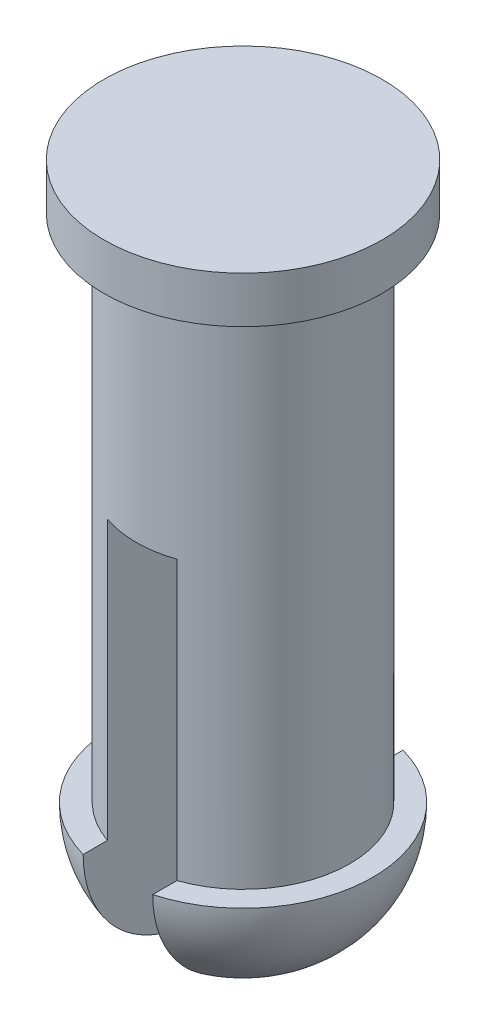
ISO-10303-21;
HEADER;
FILE_DESCRIPTION(('STEP AP214'),'2;1');
FILE_NAME('part.step','',(''),(''),'','','');
FILE_SCHEMA(('AUTOMOTIVE_DESIGN { 1 0 10303 214 1 1 1 1 }'));
ENDSEC;
DATA;
#1=APPLICATION_CONTEXT('core data for automotive mechanical design processes');
#2=APPLICATION_PROTOCOL_DEFINITION('international standard','automotive_design',2000,#1);
#3=PRODUCT_CONTEXT('',#1,'mechanical');
#4=PRODUCT('Part','Part','',(#3));
#5=PRODUCT_RELATED_PRODUCT_CATEGORY('part','',(#4));
#6=PRODUCT_DEFINITION_FORMATION('','',#4);
#7=PRODUCT_DEFINITION_CONTEXT('part definition',#1,'design');
#8=PRODUCT_DEFINITION('design','',#6,#7);
#9=PRODUCT_DEFINITION_SHAPE('','',#8);
#10=(LENGTH_UNIT() NAMED_UNIT(*) SI_UNIT(.MILLI.,.METRE.));
#11=(NAMED_UNIT(*) PLANE_ANGLE_UNIT() SI_UNIT($,.RADIAN.));
#12=(NAMED_UNIT(*) SI_UNIT($,.STERADIAN.) SOLID_ANGLE_UNIT());
#13=UNCERTAINTY_MEASURE_WITH_UNIT(LENGTH_MEASURE(1.E-05),#10,'distance_accuracy_value','');
#14=(GEOMETRIC_REPRESENTATION_CONTEXT(3) GLOBAL_UNCERTAINTY_ASSIGNED_CONTEXT((#13)) GLOBAL_UNIT_ASSIGNED_CONTEXT((#10,
#11,#12)) REPRESENTATION_CONTEXT('',''));
#15=CARTESIAN_POINT('',(0.,0.,0.));
#16=DIRECTION('',(0.,0.,1.));
#17=DIRECTION('',(1.,0.,0.));
#18=AXIS2_PLACEMENT_3D('',#15,#16,#17);
#19=CARTESIAN_POINT('',(0.,0.,0.));
#20=DIRECTION('',(0.,-1.,0.));
#21=DIRECTION('',(1.,0.,0.));
#22=AXIS2_PLACEMENT_3D('',#19,#20,#21);
#23=DEGENERATE_TOROIDAL_SURFACE('',#22,0.0721178571428574,0.639082142857143,.T.);
#24=CARTESIAN_POINT('',(-0.1905,-0.628022016788766,0.));
#25=CARTESIAN_POINT('',(-0.1905,-0.628028978236149,-0.0322642657822718));
#26=CARTESIAN_POINT('',(-0.1905,-0.626532713373925,-0.0645478073916321));
#27=CARTESIAN_POINT('',(-0.1905,-0.619907475511032,-0.128770732883926));
#28=CARTESIAN_POINT('',(-0.1905,-0.614777778845821,-0.160710046920915));
#29=CARTESIAN_POINT('',(-0.1905,-0.60014849956568,-0.223792373025473));
#30=CARTESIAN_POINT('',(-0.1905,-0.59062451547325,-0.254929899822803));
#31=CARTESIAN_POINT('',(-0.1905,-0.567070403691254,-0.315470253688697));
#32=CARTESIAN_POINT('',(-0.1905,-0.553038627973671,-0.344872441664519));
#33=CARTESIAN_POINT('',(-0.1905,-0.518209915824552,-0.405415469906864));
#34=CARTESIAN_POINT('',(-0.1905,-0.496715191844042,-0.436159065767825));
#35=CARTESIAN_POINT('',(-0.1905,-0.448574917127881,-0.493328905184819));
#36=CARTESIAN_POINT('',(-0.1905,-0.421927491568236,-0.519753570809408));
#37=CARTESIAN_POINT('',(-0.1905,-0.365958472762208,-0.566026992115614));
#38=CARTESIAN_POINT('',(-0.1905,-0.336874700482987,-0.586163980368469));
#39=CARTESIAN_POINT('',(-0.1905,-0.27570889998569,-0.621187150844694));
#40=CARTESIAN_POINT('',(-0.1905,-0.243627781161745,-0.636074919177969));
#41=CARTESIAN_POINT('',(-0.1905,-0.177843104470577,-0.659996406166478));
#42=CARTESIAN_POINT('',(-0.1905,-0.144167162083625,-0.669106146876283));
#43=CARTESIAN_POINT('',(-0.1905,-0.0757598623040417,-0.681521015958943));
#44=CARTESIAN_POINT('',(-0.1905,-0.0410284759524324,-0.684825984915537));
#45=CARTESIAN_POINT('',(-0.1905,0.0283707809178741,-0.68553253704169));
#46=CARTESIAN_POINT('',(-0.1905,0.0630384415628409,-0.6829549600045));
#47=CARTESIAN_POINT('',(-0.1905,0.131445867708354,-0.672014897502026));
#48=CARTESIAN_POINT('',(-0.1905,0.165185704546118,-0.663652858084683));
#49=CARTESIAN_POINT('',(-0.1905,0.230775593078655,-0.64138991804363));
#50=CARTESIAN_POINT('',(-0.1905,0.262626118825435,-0.627490413651513));
#51=CARTESIAN_POINT('',(-0.1905,0.323555926140559,-0.594552981969283));
#52=CARTESIAN_POINT('',(-0.1905,0.35263467707002,-0.575514073435235));
#53=CARTESIAN_POINT('',(-0.1905,0.407288537119864,-0.532787861532426));
#54=CARTESIAN_POINT('',(-0.1905,0.432852894729706,-0.509086810371126));
#55=CARTESIAN_POINT('',(-0.1905,0.479670627709356,-0.457777384508035));
#56=CARTESIAN_POINT('',(-0.1905,0.500926039943637,-0.430170866471649));
#57=CARTESIAN_POINT('',(-0.1905,0.538802050050877,-0.371556772988058));
#58=CARTESIAN_POINT('',(-0.1905,0.555374224827971,-0.340517976106002));
#59=CARTESIAN_POINT('',(-0.1905,0.58328873639689,-0.276161459376106));
#60=CARTESIAN_POINT('',(-0.1905,0.594628790597025,-0.242842752147968));
#61=CARTESIAN_POINT('',(-0.1905,0.609282893769181,-0.186037880544955));
#62=CARTESIAN_POINT('',(-0.1905,0.61400888522118,-0.162899592014926));
#63=CARTESIAN_POINT('',(-0.1905,0.62132742517583,-0.116274032273319));
#64=CARTESIAN_POINT('',(-0.1905,0.623918335476879,-0.0927865071401315));
#65=CARTESIAN_POINT('',(-0.1905,0.627287886433082,-0.0456237031929292));
#66=CARTESIAN_POINT('',(-0.1905,0.628061269000977,-0.021948077969727));
#67=CARTESIAN_POINT('',(-0.1905,0.627979825279535,0.0253956019348202));
#68=CARTESIAN_POINT('',(-0.1905,0.627125411357085,0.0490636570147581));
#69=CARTESIAN_POINT('',(-0.1905,0.62384500085713,0.0926697598580589));
#70=CARTESIAN_POINT('',(-0.1905,0.621678430930271,0.112626413228377));
#71=CARTESIAN_POINT('',(-0.1905,0.615825827860026,0.152307670854252));
#72=CARTESIAN_POINT('',(-0.1905,0.612140298519856,0.172032349821309));
#73=CARTESIAN_POINT('',(-0.1905,0.5986191198481,0.230485495946705));
#74=CARTESIAN_POINT('',(-0.1905,0.586307601019496,0.268685743906516));
#75=CARTESIAN_POINT('',(-0.1905,0.554732569913253,0.342479396348517));
#76=CARTESIAN_POINT('',(-0.1905,0.535412235306262,0.378048547339895));
#77=CARTESIAN_POINT('',(-0.1905,0.490291686538236,0.444922383401609));
#78=CARTESIAN_POINT('',(-0.1905,0.464480256586493,0.476219541094841));
#79=CARTESIAN_POINT('',(-0.1905,0.410658356281981,0.529880665855317));
#80=CARTESIAN_POINT('',(-0.1905,0.38325939515636,0.552861562665329));
#81=CARTESIAN_POINT('',(-0.1905,0.324942902050824,0.593758592324518));
#82=CARTESIAN_POINT('',(-0.1905,0.294028806307383,0.611679612778117));
#83=CARTESIAN_POINT('',(-0.1905,0.230273476935128,0.641604134677959));
#84=CARTESIAN_POINT('',(-0.1905,0.197488019113739,0.653726661439146));
#85=CARTESIAN_POINT('',(-0.1905,0.130335119073615,0.672266978907827));
#86=CARTESIAN_POINT('',(-0.1905,0.0959674485512596,0.678683943606885));
#87=CARTESIAN_POINT('',(-0.1905,0.0268197334173961,0.685602981481704));
#88=CARTESIAN_POINT('',(-0.1905,-0.00795731342040789,0.686135059546731));
#89=CARTESIAN_POINT('',(-0.1905,-0.0771048637073369,0.681347216229196));
#90=CARTESIAN_POINT('',(-0.1905,-0.111475385050694,0.676027553401809));
#91=CARTESIAN_POINT('',(-0.1905,-0.178804197514885,0.659698464121075));
#92=CARTESIAN_POINT('',(-0.1905,-0.211763721236249,0.648694118175992));
#93=CARTESIAN_POINT('',(-0.1905,-0.275371554947968,0.621318228724519));
#94=CARTESIAN_POINT('',(-0.1905,-0.306019898705296,0.604946763651908));
#95=CARTESIAN_POINT('',(-0.1905,-0.364202529798429,0.567276200594742));
#96=CARTESIAN_POINT('',(-0.1905,-0.391730871894766,0.545967922910643));
#97=CARTESIAN_POINT('',(-0.1905,-0.44285006665766,0.499060745292707));
#98=CARTESIAN_POINT('',(-0.1905,-0.466440698857277,0.473461605280124));
#99=CARTESIAN_POINT('',(-0.1905,-0.509219017451466,0.418518185170706));
#100=CARTESIAN_POINT('',(-0.1905,-0.5283733182017,0.389147938965258));
#101=CARTESIAN_POINT('',(-0.1905,-0.561612279563981,0.327685407572753));
#102=CARTESIAN_POINT('',(-0.1905,-0.575698286292219,0.295593847956517));
#103=CARTESIAN_POINT('',(-0.1905,-0.598961018152259,0.228690187421494));
#104=CARTESIAN_POINT('',(-0.1905,-0.607989636476232,0.193827135551887));
#105=CARTESIAN_POINT('',(-0.1905,-0.620915926092904,0.123209512982477));
#106=CARTESIAN_POINT('',(-0.1905,-0.624814857729785,0.0874551634716851));
#107=CARTESIAN_POINT('',(-0.1905,-0.627586391477744,0.0344342700410871));
#108=CARTESIAN_POINT('',(-0.1905,-0.628018301368988,0.0172198803831478));
#109=CARTESIAN_POINT('',(-0.1905,-0.628022016788766,0.));
#110=B_SPLINE_CURVE_WITH_KNOTS('',3,(#24,#25,#26,#27,#28,#29,#30,#31,#32,#33,#34,#35,#36,#37,
#38,#39,#40,#41,#42,#43,#44,#45,#46,#47,#48,#49,#50,#51,#52,#53,#54,#55,#56,#57,#58,#59,#60,#61,
#62,#63,#64,#65,#66,#67,#68,#69,#70,#71,#72,#73,#74,#75,#76,#77,#78,#79,#80,#81,#82,#83,#84,#85,
#86,#87,#88,#89,#90,#91,#92,#93,#94,#95,#96,#97,#98,#99,#100,#101,#102,#103,#104,#105,#106,#107,
#108,#109),.UNSPECIFIED.,.T.,.F.,(4,2,2,2,2,2,2,2,2,2,2,2,2,2,2,2,2,2,2,2,2,2,2,2,2,2,2,2,2,2,2,
2,2,2,2,2,2,2,2,2,2,2,4),(0.,0.0967752628432509,0.193569805675638,0.290908440164806,
0.388282701789652,0.500214783767242,0.61218766942305,0.71780133476043,0.823383060356042,
0.927545131447492,1.03171006309384,1.13550654806926,1.23929503004542,1.34305735905521,
1.44683951298135,1.55093241731467,1.65497600097445,1.76005898020212,1.86518776022034,
1.93593607712901,2.00673862728113,2.07774575760701,2.1487349022105,2.20890247092473,
2.26905009950688,2.38877329844792,2.50948964856729,2.63041603185557,2.7371809868521,
2.84384245627393,2.94820899126183,3.05259063319406,3.1564398244008,3.26028442728622,
3.36403638244772,3.46778682147088,3.5717317487274,3.67568249376623,3.78039179447979,
3.88507326430795,3.9926785297043,4.10025735196276,4.15190763470759),.UNSPECIFIED.);
#111=CARTESIAN_POINT('',(-0.1905,0.,0.685211784778984));
#112=VERTEX_POINT('',#111);
#113=CARTESIAN_POINT('',(-0.1905,0.,-0.685211784778984));
#114=VERTEX_POINT('',#113);
#115=EDGE_CURVE('E153',#112,#114,#110,.T.);
#116=ORIENTED_EDGE('',*,*,#115,.F.);
#117=CARTESIAN_POINT('',(0.,0.,0.));
#118=DIRECTION('',(0.,-1.,0.));
#119=DIRECTION('',(1.,0.,0.));
#120=AXIS2_PLACEMENT_3D('',#117,#118,#119);
#121=CIRCLE('',#120,0.7112);
#122=EDGE_CURVE('E155',#112,#114,#121,.T.);
#123=ORIENTED_EDGE('',*,*,#122,.T.);
#124=EDGE_LOOP('',(#116,#123));
#125=FACE_BOUND('',#124,.T.);
#126=ADVANCED_FACE('F36',(#125),#23,.T.);
#127=CARTESIAN_POINT('',(0.5842,0.,0.));
#128=DIRECTION('',(0.,1.,0.));
#129=DIRECTION('',(-1.,0.,0.));
#130=AXIS2_PLACEMENT_3D('',#127,#128,#129);
#131=PLANE('',#130);
#132=DIRECTION('',(0.,0.,1.));
#133=VECTOR('',#132,1.);
#134=CARTESIAN_POINT('',(-0.1905,0.,0.));
#135=LINE('',#134,#133);
#136=CARTESIAN_POINT('',(-0.1905,0.,-0.552267498591036));
#137=VERTEX_POINT('',#136);
#138=EDGE_CURVE('E60',#114,#137,#135,.T.);
#139=ORIENTED_EDGE('',*,*,#138,.F.);
#140=ORIENTED_EDGE('',*,*,#122,.F.);
#141=CARTESIAN_POINT('',(-0.1905,0.,0.552267498591036));
#142=VERTEX_POINT('',#141);
#143=EDGE_CURVE('E161',#142,#112,#135,.T.);
#144=ORIENTED_EDGE('',*,*,#143,.F.);
#145=CARTESIAN_POINT('',(0.,0.,0.));
#146=DIRECTION('',(0.,-1.,0.));
#147=DIRECTION('',(1.,0.,0.));
#148=AXIS2_PLACEMENT_3D('',#145,#146,#147);
#149=CIRCLE('',#148,0.5842);
#150=EDGE_CURVE('E165',#142,#137,#149,.T.);
#151=ORIENTED_EDGE('',*,*,#150,.T.);
#152=EDGE_LOOP('',(#139,#140,#144,#151));
#153=FACE_BOUND('',#152,.T.);
#154=ADVANCED_FACE('F127',(#153),#131,.T.);
#155=CARTESIAN_POINT('',(0.1905,-0.628022016788766,0.));
#156=CARTESIAN_POINT('',(0.1905,-0.628028978236148,0.032264265782271));
#157=CARTESIAN_POINT('',(0.1905,-0.626532713373925,0.0645478073916307));
#158=CARTESIAN_POINT('',(0.1905,-0.619907475511032,0.128770732883923));
#159=CARTESIAN_POINT('',(0.1905,-0.614777778845821,0.160710046920911));
#160=CARTESIAN_POINT('',(0.1905,-0.600148499565681,0.223792373025469));
#161=CARTESIAN_POINT('',(0.1905,-0.590624515473251,0.254929899822797));
#162=CARTESIAN_POINT('',(0.1905,-0.567070403691257,0.31547025368869));
#163=CARTESIAN_POINT('',(0.1905,-0.553038627973674,0.344872441664511));
#164=CARTESIAN_POINT('',(0.1905,-0.518209915824557,0.405415469906856));
#165=CARTESIAN_POINT('',(0.1905,-0.496715191844047,0.436159065767818));
#166=CARTESIAN_POINT('',(0.1905,-0.448574917127887,0.493328905184813));
#167=CARTESIAN_POINT('',(0.1905,-0.421927491568242,0.519753570809402));
#168=CARTESIAN_POINT('',(0.1905,-0.365958472762215,0.566026992115609));
#169=CARTESIAN_POINT('',(0.1905,-0.336874700482994,0.586163980368465));
#170=CARTESIAN_POINT('',(0.1905,-0.275708899985697,0.62118715084469));
#171=CARTESIAN_POINT('',(0.1905,-0.243627781161752,0.636074919177966));
#172=CARTESIAN_POINT('',(0.1905,-0.177843104470585,0.659996406166475));
#173=CARTESIAN_POINT('',(0.1905,-0.144167162083633,0.669106146876281));
#174=CARTESIAN_POINT('',(0.1905,-0.0757598623040498,0.681521015958942));
#175=CARTESIAN_POINT('',(0.1905,-0.0410284759524405,0.684825984915537));
#176=CARTESIAN_POINT('',(0.1905,0.0283707809178661,0.68553253704169));
#177=CARTESIAN_POINT('',(0.1905,0.0630384415628329,0.682954960004501));
#178=CARTESIAN_POINT('',(0.1905,0.131445867708346,0.672014897502028));
#179=CARTESIAN_POINT('',(0.1905,0.16518570454611,0.663652858084685));
#180=CARTESIAN_POINT('',(0.1905,0.230775593078648,0.641389918043633));
#181=CARTESIAN_POINT('',(0.1905,0.262626118825427,0.627490413651517));
#182=CARTESIAN_POINT('',(0.1905,0.323555926140552,0.594552981969288));
#183=CARTESIAN_POINT('',(0.1905,0.352634677070014,0.575514073435239));
#184=CARTESIAN_POINT('',(0.1905,0.407288537119858,0.532787861532431));
#185=CARTESIAN_POINT('',(0.1905,0.4328528947297,0.509086810371132));
#186=CARTESIAN_POINT('',(0.1905,0.479670627709351,0.457777384508042));
#187=CARTESIAN_POINT('',(0.1905,0.500926039943633,0.430170866471656));
#188=CARTESIAN_POINT('',(0.1905,0.538802050050873,0.371556772988065));
#189=CARTESIAN_POINT('',(0.1905,0.555374224827967,0.340517976106009));
#190=CARTESIAN_POINT('',(0.1905,0.583288736396887,0.276161459376114));
#191=CARTESIAN_POINT('',(0.1905,0.594628790597023,0.242842752147977));
#192=CARTESIAN_POINT('',(0.1905,0.609282893769179,0.186037880544964));
#193=CARTESIAN_POINT('',(0.1905,0.614008885221178,0.162899592014935));
#194=CARTESIAN_POINT('',(0.1905,0.621327425175829,0.116274032273329));
#195=CARTESIAN_POINT('',(0.1905,0.623918335476878,0.0927865071401422));
#196=CARTESIAN_POINT('',(0.1905,0.627287886433082,0.0456237031929409));
#197=CARTESIAN_POINT('',(0.1905,0.628061269000977,0.0219480779697393));
#198=CARTESIAN_POINT('',(0.1905,0.627979825279536,-0.0253956019348071));
#199=CARTESIAN_POINT('',(0.1905,0.627125411357086,-0.0490636570147447));
#200=CARTESIAN_POINT('',(0.1905,0.623845000857132,-0.0926697598580456));
#201=CARTESIAN_POINT('',(0.1905,0.621678430930273,-0.112626413228364));
#202=CARTESIAN_POINT('',(0.1905,0.615825827860028,-0.15230767085424));
#203=CARTESIAN_POINT('',(0.1905,0.612140298519859,-0.172032349821297));
#204=CARTESIAN_POINT('',(0.1905,0.598619119848104,-0.230485495946695));
#205=CARTESIAN_POINT('',(0.1905,0.586307601019499,-0.268685743906506));
#206=CARTESIAN_POINT('',(0.1905,0.554732569913257,-0.342479396348509));
#207=CARTESIAN_POINT('',(0.1905,0.535412235306266,-0.378048547339888));
#208=CARTESIAN_POINT('',(0.1905,0.49029168653824,-0.444922383401603));
#209=CARTESIAN_POINT('',(0.1905,0.464480256586497,-0.476219541094837));
#210=CARTESIAN_POINT('',(0.1905,0.410658356281985,-0.529880665855314));
#211=CARTESIAN_POINT('',(0.1905,0.383259395156364,-0.552861562665326));
#212=CARTESIAN_POINT('',(0.1905,0.324942902050828,-0.593758592324515));
#213=CARTESIAN_POINT('',(0.1905,0.294028806307387,-0.611679612778115));
#214=CARTESIAN_POINT('',(0.1905,0.230273476935132,-0.641604134677957));
#215=CARTESIAN_POINT('',(0.1905,0.197488019113743,-0.653726661439144));
#216=CARTESIAN_POINT('',(0.1905,0.130335119073619,-0.672266978907826));
#217=CARTESIAN_POINT('',(0.1905,0.0959674485512638,-0.678683943606884));
#218=CARTESIAN_POINT('',(0.1905,0.0268197334174004,-0.685602981481703));
#219=CARTESIAN_POINT('',(0.1905,-0.00795731342040355,-0.686135059546732));
#220=CARTESIAN_POINT('',(0.1905,-0.0771048637073325,-0.681347216229197));
#221=CARTESIAN_POINT('',(0.1905,-0.11147538505069,-0.67602755340181));
#222=CARTESIAN_POINT('',(0.1905,-0.17880419751488,-0.659698464121077));
#223=CARTESIAN_POINT('',(0.1905,-0.211763721236245,-0.648694118175993));
#224=CARTESIAN_POINT('',(0.1905,-0.275371554947964,-0.621318228724521));
#225=CARTESIAN_POINT('',(0.1905,-0.306019898705292,-0.604946763651911));
#226=CARTESIAN_POINT('',(0.1905,-0.364202529798425,-0.567276200594744));
#227=CARTESIAN_POINT('',(0.1905,-0.391730871894762,-0.545967922910646));
#228=CARTESIAN_POINT('',(0.1905,-0.442850066657657,-0.49906074529271));
#229=CARTESIAN_POINT('',(0.1905,-0.466440698857274,-0.473461605280127));
#230=CARTESIAN_POINT('',(0.1905,-0.509219017451464,-0.41851818517071));
#231=CARTESIAN_POINT('',(0.1905,-0.528373318201698,-0.389147938965261));
#232=CARTESIAN_POINT('',(0.1905,-0.561612279563979,-0.327685407572756));
#233=CARTESIAN_POINT('',(0.1905,-0.575698286292217,-0.295593847956521));
#234=CARTESIAN_POINT('',(0.1905,-0.598961018152258,-0.228690187421498));
#235=CARTESIAN_POINT('',(0.1905,-0.60798963647623,-0.193827135551892));
#236=CARTESIAN_POINT('',(0.1905,-0.620915926092903,-0.123209512982483));
#237=CARTESIAN_POINT('',(0.1905,-0.624814857729784,-0.0874551634716901));
#238=CARTESIAN_POINT('',(0.1905,-0.627586391477743,-0.0344342700410905));
#239=CARTESIAN_POINT('',(0.1905,-0.628018301368987,-0.0172198803831495));
#240=CARTESIAN_POINT('',(0.1905,-0.628022016788766,0.));
#241=B_SPLINE_CURVE_WITH_KNOTS('',3,(#155,#156,#157,#158,#159,#160,#161,#162,#163,#164,#165,
#166,#167,#168,#169,#170,#171,#172,#173,#174,#175,#176,#177,#178,#179,#180,#181,#182,#183,#184,
#185,#186,#187,#188,#189,#190,#191,#192,#193,#194,#195,#196,#197,#198,#199,#200,#201,#202,#203,
#204,#205,#206,#207,#208,#209,#210,#211,#212,#213,#214,#215,#216,#217,#218,#219,#220,#221,#222,
#223,#224,#225,#226,#227,#228,#229,#230,#231,#232,#233,#234,#235,#236,#237,#238,#239,#240),
.UNSPECIFIED.,.T.,.F.,(4,2,2,2,2,2,2,2,2,2,2,2,2,2,2,2,2,2,2,2,2,2,2,2,2,2,2,2,2,2,2,2,2,2,2,2,
2,2,2,2,2,2,4),(0.,0.0967752628432487,0.193569805675633,0.2909084401648,0.388282701789643,
0.500214783767234,0.612187669423042,0.717801334760421,0.823383060356033,0.927545131447484,
1.03171006309383,1.13550654806925,1.23929503004541,1.34305735905521,1.44683951298134,
1.55093241731466,1.65497600097444,1.76005898020211,1.86518776022033,1.935936077129,
2.00673862728112,2.077745757607,2.14873490221049,2.20890247092471,2.26905009950687,
2.38877329844791,2.50948964856728,2.63041603185557,2.7371809868521,2.84384245627392,
2.94820899126183,3.05259063319406,3.1564398244008,3.26028442728622,3.36403638244771,
3.46778682147087,3.5717317487274,3.67568249376622,3.78039179447978,3.88507326430794,
3.99267852970429,4.10025735196276,4.15190763470759),.UNSPECIFIED.);
#242=CARTESIAN_POINT('',(0.1905,0.,-0.685211784778984));
#243=VERTEX_POINT('',#242);
#244=CARTESIAN_POINT('',(0.1905,0.,0.685211784778984));
#245=VERTEX_POINT('',#244);
#246=EDGE_CURVE('E107',#243,#245,#241,.T.);
#247=ORIENTED_EDGE('',*,*,#246,.F.);
#248=EDGE_CURVE('E163',#243,#245,#121,.T.);
#249=ORIENTED_EDGE('',*,*,#248,.T.);
#250=EDGE_LOOP('',(#247,#249));
#251=FACE_BOUND('',#250,.T.);
#252=ADVANCED_FACE('F38',(#251),#23,.T.);
#253=CARTESIAN_POINT('',(0.,3.048,0.));
#254=DIRECTION('',(0.,1.,0.));
#255=DIRECTION('',(-1.,0.,0.));
#256=AXIS2_PLACEMENT_3D('',#253,#254,#255);
#257=PLANE('',#256);
#258=CARTESIAN_POINT('',(0.,3.04799999999994,0.));
#259=DIRECTION('',(0.,-1.,0.));
#260=DIRECTION('',(1.,0.,0.));
#261=AXIS2_PLACEMENT_3D('',#258,#259,#260);
#262=CIRCLE('',#261,0.76200000000001);
#263=CARTESIAN_POINT('',(0.762,3.04799999999994,0.));
#264=VERTEX_POINT('',#263);
#265=EDGE_CURVE('E176',#264,#264,#262,.T.);
#266=ORIENTED_EDGE('',*,*,#265,.F.);
#267=EDGE_LOOP('',(#266));
#268=FACE_BOUND('',#267,.T.);
#269=ADVANCED_FACE('F136',(#268),#257,.T.);
#270=CARTESIAN_POINT('',(3.43024899888577E-12,-1000.,0.));
#271=DIRECTION('',(0.,-1.,0.));
#272=DIRECTION('',(1.,0.,0.));
#273=AXIS2_PLACEMENT_3D('',#270,#271,#272);
#274=CYLINDRICAL_SURFACE('',#273,0.76200000000001);
#275=ORIENTED_EDGE('',*,*,#265,.T.);
#276=EDGE_LOOP('',(#275));
#277=FACE_BOUND('',#276,.T.);
#278=CARTESIAN_POINT('',(0.,2.79399999999996,0.));
#279=DIRECTION('',(0.,-1.,0.));
#280=DIRECTION('',(1.,0.,0.));
#281=AXIS2_PLACEMENT_3D('',#278,#279,#280);
#282=CIRCLE('',#281,0.76200000000001);
#283=CARTESIAN_POINT('',(0.762,2.79399999999997,0.));
#284=VERTEX_POINT('',#283);
#285=EDGE_CURVE('E173',#284,#284,#282,.T.);
#286=ORIENTED_EDGE('',*,*,#285,.F.);
#287=EDGE_LOOP('',(#286));
#288=FACE_BOUND('',#287,.T.);
#289=ADVANCED_FACE('F133',(#277,#288),#274,.T.);
#290=CARTESIAN_POINT('',(0.762,2.794,0.));
#291=DIRECTION('',(0.,-1.,0.));
#292=DIRECTION('',(1.,0.,0.));
#293=AXIS2_PLACEMENT_3D('',#290,#291,#292);
#294=PLANE('',#293);
#295=ORIENTED_EDGE('',*,*,#285,.T.);
#296=EDGE_LOOP('',(#295));
#297=FACE_BOUND('',#296,.T.);
#298=CARTESIAN_POINT('',(0.,2.79399999999996,0.));
#299=DIRECTION('',(0.,-1.,0.));
#300=DIRECTION('',(1.,0.,0.));
#301=AXIS2_PLACEMENT_3D('',#298,#299,#300);
#302=CIRCLE('',#301,0.58420000000001);
#303=CARTESIAN_POINT('',(0.5842,2.79399999999997,0.));
#304=VERTEX_POINT('',#303);
#305=EDGE_CURVE('E170',#304,#304,#302,.T.);
#306=ORIENTED_EDGE('',*,*,#305,.F.);
#307=EDGE_LOOP('',(#306));
#308=FACE_BOUND('',#307,.T.);
#309=ADVANCED_FACE('F130',(#297,#308),#294,.T.);
#310=CARTESIAN_POINT('',(3.43024899888577E-12,-1000.,0.));
#311=DIRECTION('',(0.,-1.,0.));
#312=DIRECTION('',(1.,0.,0.));
#313=AXIS2_PLACEMENT_3D('',#310,#311,#312);
#314=CYLINDRICAL_SURFACE('',#313,0.584200000000005);
#315=DIRECTION('',(0.,-1.,0.));
#316=VECTOR('',#315,1.);
#317=CARTESIAN_POINT('',(-0.1905,-1000.,0.552267498589858));
#318=LINE('',#317,#316);
#319=CARTESIAN_POINT('',(-0.1905,1.52400000000008,0.552267498591043));
#320=VERTEX_POINT('',#319);
#321=EDGE_CURVE('E157',#320,#142,#318,.T.);
#322=ORIENTED_EDGE('',*,*,#321,.F.);
#323=CARTESIAN_POINT('',(0.,1.52400000000008,0.));
#324=DIRECTION('',(0.,1.,0.));
#325=DIRECTION('',(0.,0.,1.));
#326=AXIS2_PLACEMENT_3D('',#323,#324,#325);
#327=CIRCLE('',#326,0.584200000000005);
#328=CARTESIAN_POINT('',(0.1905,1.524,0.552267498592139));
#329=VERTEX_POINT('',#328);
#330=EDGE_CURVE('E11',#329,#320,#327,.F.);
#331=ORIENTED_EDGE('',*,*,#330,.F.);
#332=DIRECTION('',(0.,-1.,0.));
#333=VECTOR('',#332,1.);
#334=CARTESIAN_POINT('',(0.190500000000248,-1000.,0.552267498592139));
#335=LINE('',#334,#333);
#336=CARTESIAN_POINT('',(0.1905,0.,0.552267498591036));
#337=VERTEX_POINT('',#336);
#338=EDGE_CURVE('E99',#337,#329,#335,.F.);
#339=ORIENTED_EDGE('',*,*,#338,.F.);
#340=CARTESIAN_POINT('',(0.1905,0.,-0.552267498591036));
#341=VERTEX_POINT('',#340);
#342=EDGE_CURVE('E106',#341,#337,#149,.T.);
#343=ORIENTED_EDGE('',*,*,#342,.F.);
#344=DIRECTION('',(0.,-1.,0.));
#345=VECTOR('',#344,1.);
#346=CARTESIAN_POINT('',(0.190500000000248,-1000.,-0.552267498592139));
#347=LINE('',#346,#345);
#348=CARTESIAN_POINT('',(0.1905,1.524,-0.552267498592139));
#349=VERTEX_POINT('',#348);
#350=EDGE_CURVE('E52',#349,#341,#347,.T.);
#351=ORIENTED_EDGE('',*,*,#350,.F.);
#352=CARTESIAN_POINT('',(-0.1905,1.52400000000008,-0.552267498591043));
#353=VERTEX_POINT('',#352);
#354=EDGE_CURVE('E41',#353,#349,#327,.F.);
#355=ORIENTED_EDGE('',*,*,#354,.F.);
#356=DIRECTION('',(0.,-1.,0.));
#357=VECTOR('',#356,1.);
#358=CARTESIAN_POINT('',(-0.1905,-1000.,-0.552267498589858));
#359=LINE('',#358,#357);
#360=EDGE_CURVE('E156',#137,#353,#359,.F.);
#361=ORIENTED_EDGE('',*,*,#360,.F.);
#362=ORIENTED_EDGE('',*,*,#150,.F.);
#363=EDGE_LOOP('',(#322,#331,#339,#343,#351,#355,#361,#362));
#364=FACE_BOUND('',#363,.T.);
#365=ORIENTED_EDGE('',*,*,#305,.T.);
#366=EDGE_LOOP('',(#365));
#367=FACE_BOUND('',#366,.T.);
#368=ADVANCED_FACE('F103',(#364,#367),#314,.T.);
#369=DIRECTION('',(0.,0.,-1.));
#370=VECTOR('',#369,1.);
#371=CARTESIAN_POINT('',(0.1905,0.,0.));
#372=LINE('',#371,#370);
#373=EDGE_CURVE('E180',#245,#337,#372,.T.);
#374=ORIENTED_EDGE('',*,*,#373,.F.);
#375=ORIENTED_EDGE('',*,*,#248,.F.);
#376=EDGE_CURVE('E179',#341,#243,#372,.T.);
#377=ORIENTED_EDGE('',*,*,#376,.F.);
#378=ORIENTED_EDGE('',*,*,#342,.T.);
#379=EDGE_LOOP('',(#374,#375,#377,#378));
#380=FACE_BOUND('',#379,.T.);
#381=ADVANCED_FACE('F122',(#380),#131,.T.);
#382=CARTESIAN_POINT('',(-0.1905,0.,-1.27));
#383=DIRECTION('',(-1.,0.,0.));
#384=DIRECTION('',(0.,0.,1.));
#385=AXIS2_PLACEMENT_3D('',#382,#383,#384);
#386=PLANE('',#385);
#387=ORIENTED_EDGE('',*,*,#360,.T.);
#388=DIRECTION('',(0.,0.,1.));
#389=VECTOR('',#388,1.);
#390=CARTESIAN_POINT('',(-0.1905,1.524,-1.27));
#391=LINE('',#390,#389);
#392=EDGE_CURVE('E95',#353,#320,#391,.T.);
#393=ORIENTED_EDGE('',*,*,#392,.T.);
#394=ORIENTED_EDGE('',*,*,#321,.T.);
#395=ORIENTED_EDGE('',*,*,#143,.T.);
#396=ORIENTED_EDGE('',*,*,#115,.T.);
#397=ORIENTED_EDGE('',*,*,#138,.T.);
#398=EDGE_LOOP('',(#387,#393,#394,#395,#396,#397));
#399=FACE_BOUND('',#398,.T.);
#400=ADVANCED_FACE('F125',(#399),#386,.F.);
#401=CARTESIAN_POINT('',(-0.1905,1.524,-1.27));
#402=DIRECTION('',(0.,1.,0.));
#403=DIRECTION('',(0.,0.,1.));
#404=AXIS2_PLACEMENT_3D('',#401,#402,#403);
#405=PLANE('',#404);
#406=ORIENTED_EDGE('',*,*,#354,.T.);
#407=DIRECTION('',(0.,0.,1.));
#408=VECTOR('',#407,1.);
#409=CARTESIAN_POINT('',(0.1905,1.524,-1.27));
#410=LINE('',#409,#408);
#411=EDGE_CURVE('E92',#349,#329,#410,.T.);
#412=ORIENTED_EDGE('',*,*,#411,.T.);
#413=ORIENTED_EDGE('',*,*,#330,.T.);
#414=ORIENTED_EDGE('',*,*,#392,.F.);
#415=EDGE_LOOP('',(#406,#412,#413,#414));
#416=FACE_BOUND('',#415,.T.);
#417=ADVANCED_FACE('F91',(#416),#405,.F.);
#418=CARTESIAN_POINT('',(0.1905,1.524,-1.27));
#419=DIRECTION('',(1.,0.,0.));
#420=DIRECTION('',(0.,1.,0.));
#421=AXIS2_PLACEMENT_3D('',#418,#419,#420);
#422=PLANE('',#421);
#423=ORIENTED_EDGE('',*,*,#338,.T.);
#424=ORIENTED_EDGE('',*,*,#411,.F.);
#425=ORIENTED_EDGE('',*,*,#350,.T.);
#426=ORIENTED_EDGE('',*,*,#376,.T.);
#427=ORIENTED_EDGE('',*,*,#246,.T.);
#428=ORIENTED_EDGE('',*,*,#373,.T.);
#429=EDGE_LOOP('',(#423,#424,#425,#426,#427,#428));
#430=FACE_BOUND('',#429,.T.);
#431=ADVANCED_FACE('F97',(#430),#422,.F.);
#432=CLOSED_SHELL('',(#126,#154,#252,#269,#289,#309,#368,#381,#400,#417,#431));
#433=MANIFOLD_SOLID_BREP('B2',#432);
#434=ADVANCED_BREP_SHAPE_REPRESENTATION('',(#18,#433),#14);
#435=SHAPE_DEFINITION_REPRESENTATION(#9,#434);
ENDSEC;
END-ISO-10303-21;
